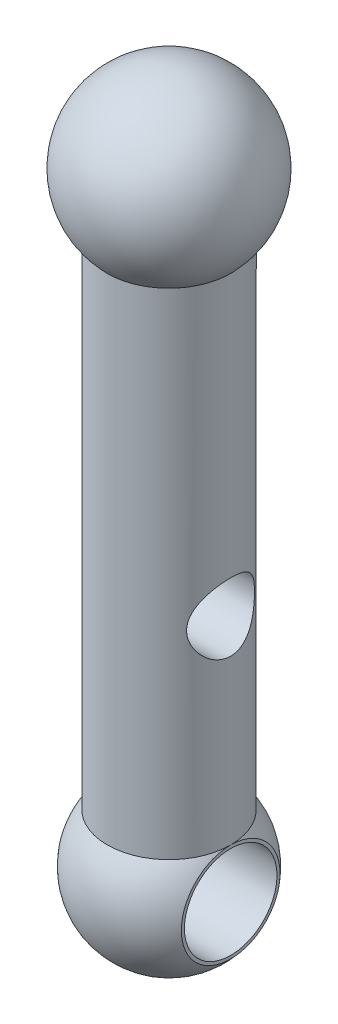
ISO-10303-21;
HEADER;
FILE_DESCRIPTION(('STEP AP214'),'2;1');
FILE_NAME('part.step','',(''),(''),'','','');
FILE_SCHEMA(('AUTOMOTIVE_DESIGN { 1 0 10303 214 1 1 1 1 }'));
ENDSEC;
DATA;
#1=APPLICATION_CONTEXT('core data for automotive mechanical design processes');
#2=APPLICATION_PROTOCOL_DEFINITION('international standard','automotive_design',2000,#1);
#3=PRODUCT_CONTEXT('',#1,'mechanical');
#4=PRODUCT('Part','Part','',(#3));
#5=PRODUCT_RELATED_PRODUCT_CATEGORY('part','',(#4));
#6=PRODUCT_DEFINITION_FORMATION('','',#4);
#7=PRODUCT_DEFINITION_CONTEXT('part definition',#1,'design');
#8=PRODUCT_DEFINITION('design','',#6,#7);
#9=PRODUCT_DEFINITION_SHAPE('','',#8);
#10=(LENGTH_UNIT() NAMED_UNIT(*) SI_UNIT(.MILLI.,.METRE.));
#11=(NAMED_UNIT(*) PLANE_ANGLE_UNIT() SI_UNIT($,.RADIAN.));
#12=(NAMED_UNIT(*) SI_UNIT($,.STERADIAN.) SOLID_ANGLE_UNIT());
#13=UNCERTAINTY_MEASURE_WITH_UNIT(LENGTH_MEASURE(1.E-05),#10,'distance_accuracy_value','');
#14=(GEOMETRIC_REPRESENTATION_CONTEXT(3) GLOBAL_UNCERTAINTY_ASSIGNED_CONTEXT((#13)) GLOBAL_UNIT_ASSIGNED_CONTEXT((#10,
#11,#12)) REPRESENTATION_CONTEXT('',''));
#15=CARTESIAN_POINT('',(0.,0.,0.));
#16=DIRECTION('',(0.,0.,1.));
#17=DIRECTION('',(1.,0.,0.));
#18=AXIS2_PLACEMENT_3D('',#15,#16,#17);
#19=CARTESIAN_POINT('',(6.35,62.23,5.08));
#20=DIRECTION('',(0.,-1.,0.));
#21=DIRECTION('',(0.,0.,-1.));
#22=AXIS2_PLACEMENT_3D('',#19,#20,#21);
#23=CYLINDRICAL_SURFACE('',#22,6.35);
#24=CARTESIAN_POINT('',(6.35,5.08,5.08));
#25=DIRECTION('',(0.,1.,0.));
#26=DIRECTION('',(0.,0.,1.));
#27=AXIS2_PLACEMENT_3D('',#24,#25,#26);
#28=CIRCLE('',#27,6.35);
#29=CARTESIAN_POINT('',(12.7,5.08,5.08));
#30=VERTEX_POINT('',#29);
#31=CARTESIAN_POINT('',(0.,5.08,5.08));
#32=VERTEX_POINT('',#31);
#33=EDGE_CURVE('E112',#30,#32,#28,.T.);
#34=ORIENTED_EDGE('',*,*,#33,.T.);
#35=EDGE_CURVE('E67',#32,#30,#28,.T.);
#36=ORIENTED_EDGE('',*,*,#35,.T.);
#37=EDGE_LOOP('',(#34,#36));
#38=FACE_BOUND('',#37,.T.);
#39=CARTESIAN_POINT('',(6.35,56.0082960533307,5.08));
#40=DIRECTION('',(0.,1.,0.));
#41=DIRECTION('',(0.,0.,1.));
#42=AXIS2_PLACEMENT_3D('',#39,#40,#41);
#43=CIRCLE('',#42,6.35);
#44=CARTESIAN_POINT('',(6.35,56.0082960533307,11.43));
#45=VERTEX_POINT('',#44);
#46=EDGE_CURVE('E60',#45,#45,#43,.T.);
#47=ORIENTED_EDGE('',*,*,#46,.F.);
#48=EDGE_LOOP('',(#47));
#49=FACE_BOUND('',#48,.T.);
#50=CARTESIAN_POINT('',(1.04670444440441,25.4,8.5725));
#51=CARTESIAN_POINT('',(1.04670575511923,25.489535345754,8.57250098943713));
#52=CARTESIAN_POINT('',(1.044429638659,25.5790600609446,8.56905282757734));
#53=CARTESIAN_POINT('',(1.03542200282067,25.7573876529089,8.5553171260089));
#54=CARTESIAN_POINT('',(1.02868902575626,25.8461902838912,8.54502734863746));
#55=CARTESIAN_POINT('',(1.01102250172501,26.0224421731033,8.5177438108454));
#56=CARTESIAN_POINT('',(1.00008394674263,26.1098896880075,8.50074205713236));
#57=CARTESIAN_POINT('',(0.974423556229443,26.2827227301648,8.46027335943702));
#58=CARTESIAN_POINT('',(0.959700028978304,26.36810731666,8.43680352416073));
#59=CARTESIAN_POINT('',(0.910820564060506,26.619217556355,8.35745178740088));
#60=CARTESIAN_POINT('',(0.871812181809527,26.7812061992312,8.29241985279525));
#61=CARTESIAN_POINT('',(0.785395954185859,27.0918179140783,8.14027875591173));
#62=CARTESIAN_POINT('',(0.737986359031733,27.2404381919826,8.05316499286143));
#63=CARTESIAN_POINT('',(0.634275854370063,27.5367524447356,7.84900116953642));
#64=CARTESIAN_POINT('',(0.577560595961573,27.6828346045038,7.72981532106193));
#65=CARTESIAN_POINT('',(0.464960975371096,27.9542128741853,7.46935095557782));
#66=CARTESIAN_POINT('',(0.409077129037707,28.079496532332,7.32805930174609));
#67=CARTESIAN_POINT('',(0.298692500939329,28.3163851235956,7.01244023197895));
#68=CARTESIAN_POINT('',(0.244722428114174,28.4258920605276,6.83631796969406));
#69=CARTESIAN_POINT('',(0.173607498758977,28.5661452311173,6.55781354845608));
#70=CARTESIAN_POINT('',(0.151536647064287,28.6089056706286,6.46255662242152));
#71=CARTESIAN_POINT('',(0.111310376654314,28.6859383725708,6.26789584389416));
#72=CARTESIAN_POINT('',(0.093152577818056,28.7202157967036,6.16849455638326));
#73=CARTESIAN_POINT('',(0.0626469840932781,28.7773355770183,5.97471132658316));
#74=CARTESIAN_POINT('',(0.0499428422617594,28.8008892747113,5.88059430619415));
#75=CARTESIAN_POINT('',(0.0286735211812102,28.8401303788581,5.69031855571329));
#76=CARTESIAN_POINT('',(0.0201061856233122,28.8558218836384,5.59416091664096));
#77=CARTESIAN_POINT('',(0.00735847055524214,28.8791169792191,5.40061329038029));
#78=CARTESIAN_POINT('',(0.00317633455585709,28.8867238083484,5.30322381243638));
#79=CARTESIAN_POINT('',(-0.00068948221195101,28.8937536206008,5.10809244520563));
#80=CARTESIAN_POINT('',(-0.000373519214286133,28.893177251805,5.01035058443921));
#81=CARTESIAN_POINT('',(0.00680628079373899,28.8801238306775,4.73836879073836));
#82=CARTESIAN_POINT('',(0.0186373095108982,28.8586202782695,4.56458757688996));
#83=CARTESIAN_POINT('',(0.0556615069875987,28.7903617899147,4.22367278255441));
#84=CARTESIAN_POINT('',(0.0808557018706434,28.7436049148247,4.05653971362097));
#85=CARTESIAN_POINT('',(0.142689982884228,28.6261848460819,3.7311005219824));
#86=CARTESIAN_POINT('',(0.179450378725029,28.5552696892532,3.57290880593253));
#87=CARTESIAN_POINT('',(0.261293179654585,28.3920544032316,3.27037119833857));
#88=CARTESIAN_POINT('',(0.306378245816571,28.2997474334946,3.12602975667319));
#89=CARTESIAN_POINT('',(0.406573787022437,28.0850210507003,2.8386251101056));
#90=CARTESIAN_POINT('',(0.462241090887295,27.9604276584331,2.69737878994768));
#91=CARTESIAN_POINT('',(0.574553926003823,27.690404797756,2.43672331568841));
#92=CARTESIAN_POINT('',(0.631200409914455,27.5449539016282,2.31733690989424));
#93=CARTESIAN_POINT('',(0.744729467928129,27.2217744563055,2.09326770555172));
#94=CARTESIAN_POINT('',(0.801196173045065,27.0423332430428,1.99079591699522));
#95=CARTESIAN_POINT('',(0.875928504911553,26.7597025043907,1.86137714304284));
#96=CARTESIAN_POINT('',(0.899181219088713,26.6632292174592,1.82228094671663));
#97=CARTESIAN_POINT('',(0.941409301914196,26.4663628614371,1.75264306485488));
#98=CARTESIAN_POINT('',(0.960387564425442,26.3659724986102,1.72209558829932));
#99=CARTESIAN_POINT('',(0.991862213235393,26.1702373623179,1.67211762196103));
#100=CARTESIAN_POINT('',(1.00475640068465,26.0751337233988,1.65199198970997));
#101=CARTESIAN_POINT('',(1.02560113829964,25.8830956333588,1.61970417238808));
#102=CARTESIAN_POINT('',(1.03355455892659,25.7861622790517,1.60753736322304));
#103=CARTESIAN_POINT('',(1.04414156152445,25.591388349601,1.59138080388951));
#104=CARTESIAN_POINT('',(1.0467789674286,25.4935484774673,1.58738517596976));
#105=CARTESIAN_POINT('',(1.04662648633955,25.2979162418173,1.58762003908698));
#106=CARTESIAN_POINT('',(1.04383719009561,25.2001238742888,1.59184963472843));
#107=CARTESIAN_POINT('',(1.02907054814852,24.9366135356247,1.61437302478434));
#108=CARTESIAN_POINT('',(1.01199019270341,24.7717708369842,1.64049803049692));
#109=CARTESIAN_POINT('',(0.964552792314423,24.4493829168969,1.715277575276));
#110=CARTESIAN_POINT('',(0.93418992055158,24.2918409317339,1.76394200256287));
#111=CARTESIAN_POINT('',(0.862228655230269,23.9806398207478,1.8843824163319));
#112=CARTESIAN_POINT('',(0.820210623128498,23.827424259302,1.95704610692948));
#113=CARTESIAN_POINT('',(0.729879159988459,23.53444792368,2.12269878768014));
#114=CARTESIAN_POINT('',(0.681562619209308,23.394693855463,2.21569783340361));
#115=CARTESIAN_POINT('',(0.574914790640032,23.1093992152702,2.43647927393096));
#116=CARTESIAN_POINT('',(0.516209675638514,22.9664501660542,2.5674381737154));
#117=CARTESIAN_POINT('',(0.401705305889082,22.7034667600526,2.85204786659053));
#118=CARTESIAN_POINT('',(0.345907769024312,22.5834458407118,3.0057118734403));
#119=CARTESIAN_POINT('',(0.267203372120776,22.420424712858,3.25510282303395));
#120=CARTESIAN_POINT('',(0.241243662210789,22.3678842780156,3.34376309418219));
#121=CARTESIAN_POINT('',(0.19235867354891,22.2705626180749,3.52602591572385));
#122=CARTESIAN_POINT('',(0.169432038993196,22.2257779233264,3.61962623153189));
#123=CARTESIAN_POINT('',(0.127299435372685,22.1445024010916,3.81110098951951));
#124=CARTESIAN_POINT('',(0.108091277225748,22.1080066916404,3.90897287516211));
#125=CARTESIAN_POINT('',(0.0739767920296887,22.0437721310644,4.10827651419473));
#126=CARTESIAN_POINT('',(0.0590698260675161,22.0160319793032,4.20970773635613));
#127=CARTESIAN_POINT('',(0.035319908230209,21.9720931373828,4.40475022481436));
#128=CARTESIAN_POINT('',(0.0260139981381108,21.9550067590222,4.49810587225881));
#129=CARTESIAN_POINT('',(0.0115203661389165,21.9284723687664,4.68620769016346));
#130=CARTESIAN_POINT('',(0.00633220683432828,21.9190235455896,4.78095371184553));
#131=CARTESIAN_POINT('',(0.000224519955164128,21.9079048839143,4.97100477189343));
#132=CARTESIAN_POINT('',(-0.000696808807867545,21.9062317630006,5.0663095573691));
#133=CARTESIAN_POINT('',(0.00174240671896469,21.9106695045585,5.25665390927694));
#134=CARTESIAN_POINT('',(0.0051027369708927,21.9167799779321,5.35169348872861));
#135=CARTESIAN_POINT('',(0.0205191272981789,21.9449079384808,5.61827517664165));
#136=CARTESIAN_POINT('',(0.0374441765465651,21.975856755583,5.78869509066225));
#137=CARTESIAN_POINT('',(0.0837179358905016,22.0619403787934,6.12140131322977));
#138=CARTESIAN_POINT('',(0.113068128393029,22.117078070833,6.2836866486796));
#139=CARTESIAN_POINT('',(0.182883375431909,22.2516974824001,6.60204449489437));
#140=CARTESIAN_POINT('',(0.223694069146264,22.3319469151209,6.75771501562496));
#141=CARTESIAN_POINT('',(0.312596481324202,22.5135545699882,7.05388360337902));
#142=CARTESIAN_POINT('',(0.360691142222265,22.6149213289416,7.19437549936331));
#143=CARTESIAN_POINT('',(0.466206338956842,22.8492640006255,7.473361850866));
#144=CARTESIAN_POINT('',(0.524063308008845,22.9845343453062,7.60976878296295));
#145=CARTESIAN_POINT('',(0.638727006124132,23.2759246585603,7.85897803198975));
#146=CARTESIAN_POINT('',(0.695532379688012,23.4320696571402,7.9717515876092));
#147=CARTESIAN_POINT('',(0.805498741244005,23.7738775025323,8.17766878567284));
#148=CARTESIAN_POINT('',(0.858167399646991,23.9608118108709,8.26901212875524));
#149=CARTESIAN_POINT('',(0.92496311707175,24.2532199591487,8.38050661118125));
#150=CARTESIAN_POINT('',(0.945182215649717,24.3526040210895,8.41340146564785));
#151=CARTESIAN_POINT('',(0.980682855435676,24.5547236646445,8.47028922762736));
#152=CARTESIAN_POINT('',(0.995967544977766,24.6574570630013,8.49428781274189));
#153=CARTESIAN_POINT('',(1.02091827544991,24.8661596782627,8.53310408746971));
#154=CARTESIAN_POINT('',(1.03053962115741,24.9721478674667,8.54784880416479));
#155=CARTESIAN_POINT('',(1.04343185001365,25.1854291441492,8.56754605912758));
#156=CARTESIAN_POINT('',(1.04670287395646,25.2927222026441,8.57249881449461));
#157=CARTESIAN_POINT('',(1.04670444440441,25.4,8.5725));
#158=B_SPLINE_CURVE_WITH_KNOTS('',3,(#50,#51,#52,#53,#54,#55,#56,#57,#58,#59,#60,#61,#62,#63,
#64,#65,#66,#67,#68,#69,#70,#71,#72,#73,#74,#75,#76,#77,#78,#79,#80,#81,#82,#83,#84,#85,#86,#87,
#88,#89,#90,#91,#92,#93,#94,#95,#96,#97,#98,#99,#100,#101,#102,#103,#104,#105,#106,#107,#108,
#109,#110,#111,#112,#113,#114,#115,#116,#117,#118,#119,#120,#121,#122,#123,#124,#125,#126,#127,
#128,#129,#130,#131,#132,#133,#134,#135,#136,#137,#138,#139,#140,#141,#142,#143,#144,#145,#146,
#147,#148,#149,#150,#151,#152,#153,#154,#155,#156,#157),.UNSPECIFIED.,.T.,.F.,(4,2,2,2,2,2,2,2,
2,2,2,2,2,2,2,2,2,2,2,2,2,2,2,2,2,2,2,2,2,2,2,2,2,2,2,2,2,2,2,2,2,2,2,2,2,2,2,2,2,2,2,2,2,4),
(0.,0.268493071179449,0.537074000655839,0.805975752723736,1.07499790194786,1.60910083265285,
2.14331513587033,2.73152275397339,3.3200812634609,3.95917269233966,4.27893876898506,
4.59850979495002,4.89164705115328,5.18463134427104,5.47749823781328,5.77034193743764,
6.29412375068984,6.81794578963769,7.34740746108032,7.87703867475344,8.46379227739872,
9.05115305160151,9.6900792037978,10.009655134373,10.3290140528877,10.6227581916427,
10.9163315124471,11.2096935836511,11.5030237213303,12.0038101939876,12.5048165739873,
13.0269406420478,13.5493234799406,14.1544734334391,14.7599769652098,15.0784426629976,
15.3967655201099,15.7149004055531,16.0329880098503,16.3186810562236,16.6043437515245,
16.8898858469391,17.175413668811,17.6948930369522,18.2144344001098,18.7517349541136,
19.2892531380766,19.8885829748216,20.4886380009864,21.1285307684687,21.4479535237465,
21.7671720709313,22.0888772440591,22.4105752845246),.UNSPECIFIED.);
#159=CARTESIAN_POINT('',(1.04670444440441,25.4,8.5725));
#160=VERTEX_POINT('',#159);
#161=EDGE_CURVE('E11',#160,#160,#158,.T.);
#162=ORIENTED_EDGE('',*,*,#161,.F.);
#163=EDGE_LOOP('',(#162));
#164=FACE_BOUND('',#163,.T.);
#165=CARTESIAN_POINT('',(11.6532955555956,25.4,8.5725));
#166=CARTESIAN_POINT('',(11.6532942448808,25.310464654246,8.57250098943713));
#167=CARTESIAN_POINT('',(11.655570361341,25.2209399390554,8.56905282757734));
#168=CARTESIAN_POINT('',(11.6645779971793,25.042612347091,8.5553171260089));
#169=CARTESIAN_POINT('',(11.6713109742437,24.9538097161088,8.54502734863746));
#170=CARTESIAN_POINT('',(11.688977498275,24.7775578268967,8.5177438108454));
#171=CARTESIAN_POINT('',(11.6999160532574,24.6901103119925,8.50074205713236));
#172=CARTESIAN_POINT('',(11.7255764437706,24.5172772698352,8.46027335943702));
#173=CARTESIAN_POINT('',(11.7402999710217,24.43189268334,8.43680352416073));
#174=CARTESIAN_POINT('',(11.7891794359395,24.180782443645,8.35745178740088));
#175=CARTESIAN_POINT('',(11.8281878181905,24.0187938007688,8.29241985279525));
#176=CARTESIAN_POINT('',(11.9146040458141,23.7081820859217,8.14027875591173));
#177=CARTESIAN_POINT('',(11.9620136409683,23.5595618080174,8.05316499286143));
#178=CARTESIAN_POINT('',(12.0657241456299,23.2632475552644,7.84900116953642));
#179=CARTESIAN_POINT('',(12.1224394040384,23.1171653954962,7.72981532106193));
#180=CARTESIAN_POINT('',(12.2350390246289,22.8457871258147,7.46935095557781));
#181=CARTESIAN_POINT('',(12.2909228709623,22.720503467668,7.32805930174609));
#182=CARTESIAN_POINT('',(12.4013074990607,22.4836148764044,7.01244023197895));
#183=CARTESIAN_POINT('',(12.4552775718858,22.3741079394724,6.83631796969406));
#184=CARTESIAN_POINT('',(12.526392501241,22.2338547688827,6.55781354845608));
#185=CARTESIAN_POINT('',(12.5484633529357,22.1910943293714,6.46255662242152));
#186=CARTESIAN_POINT('',(12.5886896233457,22.1140616274292,6.26789584389416));
#187=CARTESIAN_POINT('',(12.6068474221819,22.0797842032964,6.16849455638326));
#188=CARTESIAN_POINT('',(12.6373530159067,22.0226644229817,5.97471132658316));
#189=CARTESIAN_POINT('',(12.6500571577382,21.9991107252887,5.88059430619415));
#190=CARTESIAN_POINT('',(12.6713264788188,21.9598696211419,5.69031855571329));
#191=CARTESIAN_POINT('',(12.6798938143767,21.9441781163616,5.59416091664096));
#192=CARTESIAN_POINT('',(12.6926415294448,21.9208830207809,5.40061329038029));
#193=CARTESIAN_POINT('',(12.6968236654441,21.9132761916516,5.30322381243638));
#194=CARTESIAN_POINT('',(12.700689482212,21.9062463793992,5.10809244520563));
#195=CARTESIAN_POINT('',(12.7003735192143,21.906822748195,5.01035058443921));
#196=CARTESIAN_POINT('',(12.6931937192063,21.9198761693225,4.73836879073836));
#197=CARTESIAN_POINT('',(12.6813626904891,21.9413797217305,4.56458757688996));
#198=CARTESIAN_POINT('',(12.6443384930124,22.0096382100853,4.22367278255441));
#199=CARTESIAN_POINT('',(12.6191442981294,22.0563950851753,4.05653971362097));
#200=CARTESIAN_POINT('',(12.5573100171158,22.1738151539181,3.7311005219824));
#201=CARTESIAN_POINT('',(12.520549621275,22.2447303107468,3.57290880593253));
#202=CARTESIAN_POINT('',(12.4387068203454,22.4079455967684,3.27037119833857));
#203=CARTESIAN_POINT('',(12.3936217541834,22.5002525665054,3.12602975667319));
#204=CARTESIAN_POINT('',(12.2934262129776,22.7149789492997,2.83862511010561));
#205=CARTESIAN_POINT('',(12.2377589091127,22.8395723415669,2.69737878994768));
#206=CARTESIAN_POINT('',(12.1254460739962,23.109595202244,2.43672331568841));
#207=CARTESIAN_POINT('',(12.0687995900855,23.2550460983718,2.31733690989424));
#208=CARTESIAN_POINT('',(11.9552705320719,23.5782255436945,2.09326770555172));
#209=CARTESIAN_POINT('',(11.8988038269549,23.7576667569572,1.99079591699522));
#210=CARTESIAN_POINT('',(11.8240714950884,24.0402974956093,1.86137714304284));
#211=CARTESIAN_POINT('',(11.8008187809113,24.1367707825408,1.82228094671663));
#212=CARTESIAN_POINT('',(11.7585906980858,24.3336371385629,1.75264306485488));
#213=CARTESIAN_POINT('',(11.7396124355746,24.4340275013898,1.72209558829932));
#214=CARTESIAN_POINT('',(11.7081377867646,24.6297626376821,1.67211762196103));
#215=CARTESIAN_POINT('',(11.6952435993154,24.7248662766012,1.65199198970997));
#216=CARTESIAN_POINT('',(11.6743988617004,24.9169043666411,1.61970417238808));
#217=CARTESIAN_POINT('',(11.6664454410734,25.0138377209483,1.60753736322304));
#218=CARTESIAN_POINT('',(11.6558584384756,25.208611650399,1.59138080388951));
#219=CARTESIAN_POINT('',(11.6532210325714,25.3064515225327,1.58738517596976));
#220=CARTESIAN_POINT('',(11.6533735136604,25.5020837581827,1.58762003908698));
#221=CARTESIAN_POINT('',(11.6561628099044,25.5998761257112,1.59184963472843));
#222=CARTESIAN_POINT('',(11.6709294518515,25.8633864643753,1.61437302478434));
#223=CARTESIAN_POINT('',(11.6880098072966,26.0282291630158,1.64049803049692));
#224=CARTESIAN_POINT('',(11.7354472076856,26.3506170831031,1.715277575276));
#225=CARTESIAN_POINT('',(11.7658100794484,26.5081590682661,1.76394200256287));
#226=CARTESIAN_POINT('',(11.8377713447697,26.8193601792522,1.8843824163319));
#227=CARTESIAN_POINT('',(11.8797893768715,26.972575740698,1.95704610692948));
#228=CARTESIAN_POINT('',(11.9701208400115,27.26555207632,2.12269878768014));
#229=CARTESIAN_POINT('',(12.0184373807907,27.405306144537,2.21569783340361));
#230=CARTESIAN_POINT('',(12.12508520936,27.6906007847298,2.43647927393096));
#231=CARTESIAN_POINT('',(12.1837903243615,27.8335498339458,2.5674381737154));
#232=CARTESIAN_POINT('',(12.2982946941109,28.0965332399474,2.85204786659053));
#233=CARTESIAN_POINT('',(12.3540922309757,28.2165541592882,3.0057118734403));
#234=CARTESIAN_POINT('',(12.4327966278792,28.379575287142,3.25510282303395));
#235=CARTESIAN_POINT('',(12.4587563377892,28.4321157219844,3.34376309418219));
#236=CARTESIAN_POINT('',(12.5076413264511,28.5294373819251,3.52602591572384));
#237=CARTESIAN_POINT('',(12.5305679610068,28.5742220766736,3.61962623153189));
#238=CARTESIAN_POINT('',(12.5727005646273,28.6554975989084,3.81110098951951));
#239=CARTESIAN_POINT('',(12.5919087227743,28.6919933083596,3.90897287516211));
#240=CARTESIAN_POINT('',(12.6260232079703,28.7562278689356,4.10827651419473));
#241=CARTESIAN_POINT('',(12.6409301739325,28.7839680206968,4.20970773635613));
#242=CARTESIAN_POINT('',(12.6646800917698,28.8279068626172,4.40475022481436));
#243=CARTESIAN_POINT('',(12.6739860018619,28.8449932409778,4.49810587225881));
#244=CARTESIAN_POINT('',(12.6884796338611,28.8715276312336,4.68620769016346));
#245=CARTESIAN_POINT('',(12.6936677931657,28.8809764544104,4.78095371184553));
#246=CARTESIAN_POINT('',(12.6997754800448,28.8920951160857,4.97100477189343));
#247=CARTESIAN_POINT('',(12.7006968088079,28.8937682369994,5.0663095573691));
#248=CARTESIAN_POINT('',(12.698257593281,28.8893304954415,5.25665390927694));
#249=CARTESIAN_POINT('',(12.6948972630291,28.8832200220679,5.35169348872861));
#250=CARTESIAN_POINT('',(12.6794808727018,28.8550920615192,5.61827517664165));
#251=CARTESIAN_POINT('',(12.6625558234534,28.824143244417,5.78869509066225));
#252=CARTESIAN_POINT('',(12.6162820641095,28.7380596212066,6.12140131322977));
#253=CARTESIAN_POINT('',(12.586931871607,28.682921929167,6.2836866486796));
#254=CARTESIAN_POINT('',(12.5171166245681,28.5483025175999,6.60204449489437));
#255=CARTESIAN_POINT('',(12.4763059308537,28.4680530848791,6.75771501562496));
#256=CARTESIAN_POINT('',(12.3874035186758,28.2864454300118,7.05388360337902));
#257=CARTESIAN_POINT('',(12.3393088577777,28.1850786710584,7.19437549936331));
#258=CARTESIAN_POINT('',(12.2337936610432,27.9507359993745,7.473361850866));
#259=CARTESIAN_POINT('',(12.1759366919912,27.8154656546938,7.60976878296295));
#260=CARTESIAN_POINT('',(12.0612729938759,27.5240753414397,7.85897803198975));
#261=CARTESIAN_POINT('',(12.004467620312,27.3679303428598,7.9717515876092));
#262=CARTESIAN_POINT('',(11.894501258756,27.0261224974677,8.17766878567284));
#263=CARTESIAN_POINT('',(11.841832600353,26.8391881891291,8.26901212875523));
#264=CARTESIAN_POINT('',(11.7750368829282,26.5467800408513,8.38050661118125));
#265=CARTESIAN_POINT('',(11.7548177843503,26.4473959789105,8.41340146564785));
#266=CARTESIAN_POINT('',(11.7193171445643,26.2452763353555,8.47028922762735));
#267=CARTESIAN_POINT('',(11.7040324550222,26.1425429369987,8.49428781274189));
#268=CARTESIAN_POINT('',(11.6790817245501,25.9338403217373,8.53310408746971));
#269=CARTESIAN_POINT('',(11.6694603788426,25.8278521325333,8.54784880416479));
#270=CARTESIAN_POINT('',(11.6565681499864,25.6145708558508,8.56754605912758));
#271=CARTESIAN_POINT('',(11.6532971260435,25.5072777973559,8.57249881449461));
#272=CARTESIAN_POINT('',(11.6532955555956,25.4,8.5725));
#273=B_SPLINE_CURVE_WITH_KNOTS('',3,(#165,#166,#167,#168,#169,#170,#171,#172,#173,#174,#175,
#176,#177,#178,#179,#180,#181,#182,#183,#184,#185,#186,#187,#188,#189,#190,#191,#192,#193,#194,
#195,#196,#197,#198,#199,#200,#201,#202,#203,#204,#205,#206,#207,#208,#209,#210,#211,#212,#213,
#214,#215,#216,#217,#218,#219,#220,#221,#222,#223,#224,#225,#226,#227,#228,#229,#230,#231,#232,
#233,#234,#235,#236,#237,#238,#239,#240,#241,#242,#243,#244,#245,#246,#247,#248,#249,#250,#251,
#252,#253,#254,#255,#256,#257,#258,#259,#260,#261,#262,#263,#264,#265,#266,#267,#268,#269,#270,
#271,#272),.UNSPECIFIED.,.T.,.F.,(4,2,2,2,2,2,2,2,2,2,2,2,2,2,2,2,2,2,2,2,2,2,2,2,2,2,2,2,2,2,2,
2,2,2,2,2,2,2,2,2,2,2,2,2,2,2,2,2,2,2,2,2,2,4),(0.,0.268493071179453,0.537074000655842,
0.805975752723736,1.07499790194786,1.60910083265285,2.14331513587033,2.73152275397339,
3.3200812634609,3.95917269233966,4.27893876898505,4.59850979495002,4.89164705115328,
5.18463134427103,5.47749823781328,5.77034193743764,6.29412375068984,6.81794578963769,
7.34740746108032,7.87703867475344,8.46379227739871,9.05115305160151,9.6900792037978,
10.009655134373,10.3290140528877,10.6227581916427,10.9163315124471,11.2096935836511,
11.5030237213303,12.0038101939876,12.5048165739873,13.0269406420478,13.5493234799406,
14.1544734334391,14.7599769652098,15.0784426629976,15.3967655201099,15.7149004055531,
16.0329880098503,16.3186810562236,16.6043437515245,16.8898858469391,17.175413668811,
17.6948930369522,18.2144344001098,18.7517349541136,19.2892531380766,19.8885829748216,
20.4886380009863,21.1285307684687,21.4479535237465,21.7671720709313,22.0888772440591,
22.4105752845246),.UNSPECIFIED.);
#274=CARTESIAN_POINT('',(11.6532955555956,25.4,8.5725));
#275=VERTEX_POINT('',#274);
#276=EDGE_CURVE('E49',#275,#275,#273,.T.);
#277=ORIENTED_EDGE('',*,*,#276,.F.);
#278=EDGE_LOOP('',(#277));
#279=FACE_BOUND('',#278,.T.);
#280=ADVANCED_FACE('F45',(#38,#49,#164,#279),#23,.T.);
#281=CARTESIAN_POINT('',(6.35,0.,5.08));
#282=DIRECTION('',(-1.,0.,0.));
#283=DIRECTION('',(0.,0.,-1.));
#284=AXIS2_PLACEMENT_3D('',#281,#282,#283);
#285=SPHERICAL_SURFACE('',#284,8.13196778153972);
#286=ORIENTED_EDGE('',*,*,#33,.F.);
#287=CARTESIAN_POINT('',(12.7,0.,5.08));
#288=DIRECTION('',(-1.,0.,0.));
#289=DIRECTION('',(0.,0.,1.));
#290=AXIS2_PLACEMENT_3D('',#287,#288,#289);
#291=CIRCLE('',#290,5.08);
#292=EDGE_CURVE('E71',#30,#30,#291,.T.);
#293=ORIENTED_EDGE('',*,*,#292,.T.);
#294=ORIENTED_EDGE('',*,*,#35,.F.);
#295=CARTESIAN_POINT('',(0.,0.,5.08));
#296=DIRECTION('',(-1.,0.,0.));
#297=DIRECTION('',(0.,0.,1.));
#298=AXIS2_PLACEMENT_3D('',#295,#296,#297);
#299=CIRCLE('',#298,5.08);
#300=EDGE_CURVE('E75',#32,#32,#299,.T.);
#301=ORIENTED_EDGE('',*,*,#300,.F.);
#302=EDGE_LOOP('',(#286,#293,#294,#301));
#303=FACE_BOUND('',#302,.T.);
#304=ADVANCED_FACE('F47',(#303),#285,.T.);
#305=CARTESIAN_POINT('',(12.7,0.,5.08));
#306=DIRECTION('',(-1.,0.,0.));
#307=DIRECTION('',(0.,0.,1.));
#308=AXIS2_PLACEMENT_3D('',#305,#306,#307);
#309=PLANE('',#308);
#310=CARTESIAN_POINT('',(12.7,0.,5.08));
#311=DIRECTION('',(-1.,0.,0.));
#312=DIRECTION('',(0.,0.,1.));
#313=AXIS2_PLACEMENT_3D('',#310,#311,#312);
#314=CIRCLE('',#313,4.7625);
#315=CARTESIAN_POINT('',(12.7,0.,9.8425));
#316=VERTEX_POINT('',#315);
#317=EDGE_CURVE('E81',#316,#316,#314,.T.);
#318=ORIENTED_EDGE('',*,*,#317,.T.);
#319=EDGE_LOOP('',(#318));
#320=FACE_BOUND('',#319,.T.);
#321=ORIENTED_EDGE('',*,*,#292,.F.);
#322=EDGE_LOOP('',(#321));
#323=FACE_BOUND('',#322,.T.);
#324=ADVANCED_FACE('F72',(#320,#323),#309,.F.);
#325=CARTESIAN_POINT('',(0.,0.,0.));
#326=DIRECTION('',(1.,0.,0.));
#327=DIRECTION('',(0.,0.,-1.));
#328=AXIS2_PLACEMENT_3D('',#325,#326,#327);
#329=PLANE('',#328);
#330=CARTESIAN_POINT('',(0.,0.,5.08));
#331=DIRECTION('',(-1.,0.,0.));
#332=DIRECTION('',(0.,0.,1.));
#333=AXIS2_PLACEMENT_3D('',#330,#331,#332);
#334=CIRCLE('',#333,4.7625);
#335=CARTESIAN_POINT('',(0.,0.,9.8425));
#336=VERTEX_POINT('',#335);
#337=EDGE_CURVE('E124',#336,#336,#334,.T.);
#338=ORIENTED_EDGE('',*,*,#337,.F.);
#339=EDGE_LOOP('',(#338));
#340=FACE_BOUND('',#339,.T.);
#341=ORIENTED_EDGE('',*,*,#300,.T.);
#342=EDGE_LOOP('',(#341));
#343=FACE_BOUND('',#342,.T.);
#344=ADVANCED_FACE('F104',(#340,#343),#329,.F.);
#345=CARTESIAN_POINT('',(22.86,0.,5.08));
#346=DIRECTION('',(-1.,0.,0.));
#347=DIRECTION('',(0.,0.,1.));
#348=AXIS2_PLACEMENT_3D('',#345,#346,#347);
#349=CYLINDRICAL_SURFACE('',#348,4.7625);
#350=ORIENTED_EDGE('',*,*,#337,.T.);
#351=EDGE_LOOP('',(#350));
#352=FACE_BOUND('',#351,.T.);
#353=ORIENTED_EDGE('',*,*,#317,.F.);
#354=EDGE_LOOP('',(#353));
#355=FACE_BOUND('',#354,.T.);
#356=ADVANCED_FACE('F97',(#352,#355),#349,.F.);
#357=CARTESIAN_POINT('',(6.35,62.23,5.08));
#358=DIRECTION('',(0.,0.,-1.));
#359=DIRECTION('',(-1.,0.,0.));
#360=AXIS2_PLACEMENT_3D('',#357,#358,#359);
#361=SPHERICAL_SURFACE('',#360,8.89);
#362=CARTESIAN_POINT('',(6.35,62.23,5.08));
#363=DIRECTION('',(0.,1.,0.));
#364=DIRECTION('',(0.,0.,1.));
#365=AXIS2_PLACEMENT_3D('',#362,#363,#364);
#366=SPHERICAL_SURFACE('',#365,8.89);
#367=ORIENTED_EDGE('',*,*,#46,.T.);
#368=EDGE_LOOP('',(#367));
#369=FACE_BOUND('',#368,.T.);
#370=ADVANCED_FACE('F93',(#369),#366,.T.);
#371=CARTESIAN_POINT('',(15.24,25.4,5.08));
#372=DIRECTION('',(-1.,0.,0.));
#373=DIRECTION('',(0.,0.,1.));
#374=AXIS2_PLACEMENT_3D('',#371,#372,#373);
#375=CYLINDRICAL_SURFACE('',#374,3.4925);
#376=ORIENTED_EDGE('',*,*,#161,.T.);
#377=EDGE_LOOP('',(#376));
#378=FACE_BOUND('',#377,.T.);
#379=ORIENTED_EDGE('',*,*,#276,.T.);
#380=EDGE_LOOP('',(#379));
#381=FACE_BOUND('',#380,.T.);
#382=ADVANCED_FACE('F90',(#378,#381),#375,.F.);
#383=CLOSED_SHELL('',(#280,#304,#324,#344,#356,#370,#382));
#384=MANIFOLD_SOLID_BREP('B2',#383);
#385=ADVANCED_BREP_SHAPE_REPRESENTATION('',(#18,#384),#14);
#386=SHAPE_DEFINITION_REPRESENTATION(#9,#385);
ENDSEC;
END-ISO-10303-21;
